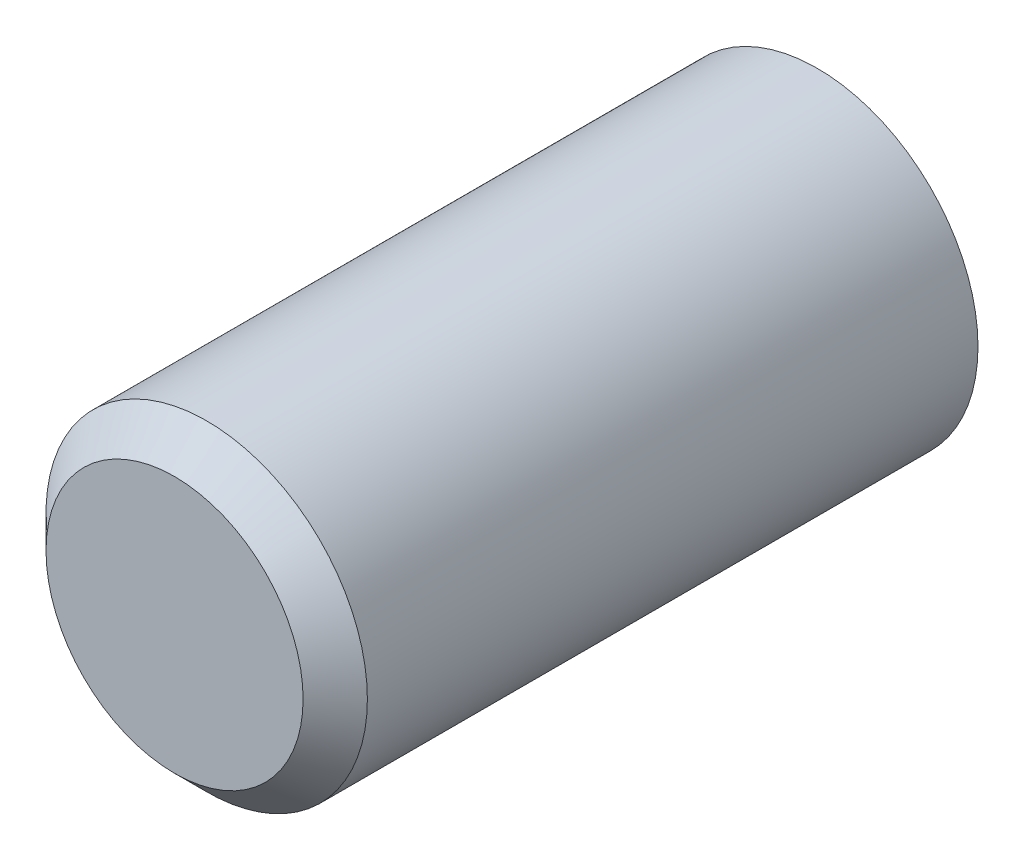
ISO-10303-21;
HEADER;
FILE_DESCRIPTION(('STEP AP214'),'2;1');
FILE_NAME('part.step','',(''),(''),'','','');
FILE_SCHEMA(('AUTOMOTIVE_DESIGN { 1 0 10303 214 1 1 1 1 }'));
ENDSEC;
DATA;
#1=APPLICATION_CONTEXT('core data for automotive mechanical design processes');
#2=APPLICATION_PROTOCOL_DEFINITION('international standard','automotive_design',2000,#1);
#3=PRODUCT_CONTEXT('',#1,'mechanical');
#4=PRODUCT('Part','Part','',(#3));
#5=PRODUCT_RELATED_PRODUCT_CATEGORY('part','',(#4));
#6=PRODUCT_DEFINITION_FORMATION('','',#4);
#7=PRODUCT_DEFINITION_CONTEXT('part definition',#1,'design');
#8=PRODUCT_DEFINITION('design','',#6,#7);
#9=PRODUCT_DEFINITION_SHAPE('','',#8);
#10=(LENGTH_UNIT() NAMED_UNIT(*) SI_UNIT(.MILLI.,.METRE.));
#11=(NAMED_UNIT(*) PLANE_ANGLE_UNIT() SI_UNIT($,.RADIAN.));
#12=(NAMED_UNIT(*) SI_UNIT($,.STERADIAN.) SOLID_ANGLE_UNIT());
#13=UNCERTAINTY_MEASURE_WITH_UNIT(LENGTH_MEASURE(1.E-05),#10,'distance_accuracy_value','');
#14=(GEOMETRIC_REPRESENTATION_CONTEXT(3) GLOBAL_UNCERTAINTY_ASSIGNED_CONTEXT((#13)) GLOBAL_UNIT_ASSIGNED_CONTEXT((#10,
#11,#12)) REPRESENTATION_CONTEXT('',''));
#15=CARTESIAN_POINT('',(0.,0.,0.));
#16=DIRECTION('',(0.,0.,1.));
#17=DIRECTION('',(1.,0.,0.));
#18=AXIS2_PLACEMENT_3D('',#15,#16,#17);
#19=CARTESIAN_POINT('',(0.,0.,100.));
#20=DIRECTION('',(0.,0.,-1.));
#21=DIRECTION('',(-1.,0.,0.));
#22=AXIS2_PLACEMENT_3D('',#19,#20,#21);
#23=CYLINDRICAL_SURFACE('',#22,25.);
#24=CARTESIAN_POINT('',(0.,0.,95.));
#25=DIRECTION('',(0.,0.,1.));
#26=DIRECTION('',(1.,0.,0.));
#27=AXIS2_PLACEMENT_3D('',#24,#25,#26);
#28=CIRCLE('',#27,25.);
#29=CARTESIAN_POINT('',(25.,0.,95.));
#30=VERTEX_POINT('',#29);
#31=EDGE_CURVE('E10',#30,#30,#28,.F.);
#32=ORIENTED_EDGE('',*,*,#31,.T.);
#33=EDGE_LOOP('',(#32));
#34=FACE_BOUND('',#33,.T.);
#35=CARTESIAN_POINT('',(0.,0.,0.));
#36=DIRECTION('',(0.,0.,1.));
#37=DIRECTION('',(1.,0.,0.));
#38=AXIS2_PLACEMENT_3D('',#35,#36,#37);
#39=CIRCLE('',#38,25.);
#40=CARTESIAN_POINT('',(25.,0.,0.));
#41=VERTEX_POINT('',#40);
#42=EDGE_CURVE('E49',#41,#41,#39,.T.);
#43=ORIENTED_EDGE('',*,*,#42,.T.);
#44=EDGE_LOOP('',(#43));
#45=FACE_BOUND('',#44,.T.);
#46=ADVANCED_FACE('F37',(#34,#45),#23,.T.);
#47=CARTESIAN_POINT('',(0.,0.,100.));
#48=DIRECTION('',(0.,0.,1.));
#49=DIRECTION('',(1.,0.,0.));
#50=AXIS2_PLACEMENT_3D('',#47,#48,#49);
#51=PLANE('',#50);
#52=CARTESIAN_POINT('',(0.,0.,100.));
#53=DIRECTION('',(0.,0.,1.));
#54=DIRECTION('',(1.,0.,0.));
#55=AXIS2_PLACEMENT_3D('',#52,#53,#54);
#56=CIRCLE('',#55,20.);
#57=CARTESIAN_POINT('',(20.,0.,100.));
#58=VERTEX_POINT('',#57);
#59=EDGE_CURVE('E45',#58,#58,#56,.T.);
#60=ORIENTED_EDGE('',*,*,#59,.T.);
#61=EDGE_LOOP('',(#60));
#62=FACE_BOUND('',#61,.T.);
#63=ADVANCED_FACE('F59',(#62),#51,.T.);
#64=CARTESIAN_POINT('',(0.,0.,0.));
#65=DIRECTION('',(0.,0.,1.));
#66=DIRECTION('',(1.,0.,0.));
#67=AXIS2_PLACEMENT_3D('',#64,#65,#66);
#68=PLANE('',#67);
#69=ORIENTED_EDGE('',*,*,#42,.F.);
#70=EDGE_LOOP('',(#69));
#71=FACE_BOUND('',#70,.T.);
#72=ADVANCED_FACE('F57',(#71),#68,.F.);
#73=CARTESIAN_POINT('',(0.,0.,100.));
#74=DIRECTION('',(0.,0.,-1.));
#75=DIRECTION('',(-1.,0.,0.));
#76=AXIS2_PLACEMENT_3D('',#73,#74,#75);
#77=CONICAL_SURFACE('',#76,20.,0.785398163397448);
#78=ORIENTED_EDGE('',*,*,#31,.F.);
#79=EDGE_LOOP('',(#78));
#80=FACE_BOUND('',#79,.T.);
#81=ORIENTED_EDGE('',*,*,#59,.F.);
#82=EDGE_LOOP('',(#81));
#83=FACE_BOUND('',#82,.T.);
#84=ADVANCED_FACE('F40',(#80,#83),#77,.T.);
#85=CLOSED_SHELL('',(#46,#63,#72,#84));
#86=MANIFOLD_SOLID_BREP('B2',#85);
#87=ADVANCED_BREP_SHAPE_REPRESENTATION('',(#18,#86),#14);
#88=SHAPE_DEFINITION_REPRESENTATION(#9,#87);
ENDSEC;
END-ISO-10303-21;
